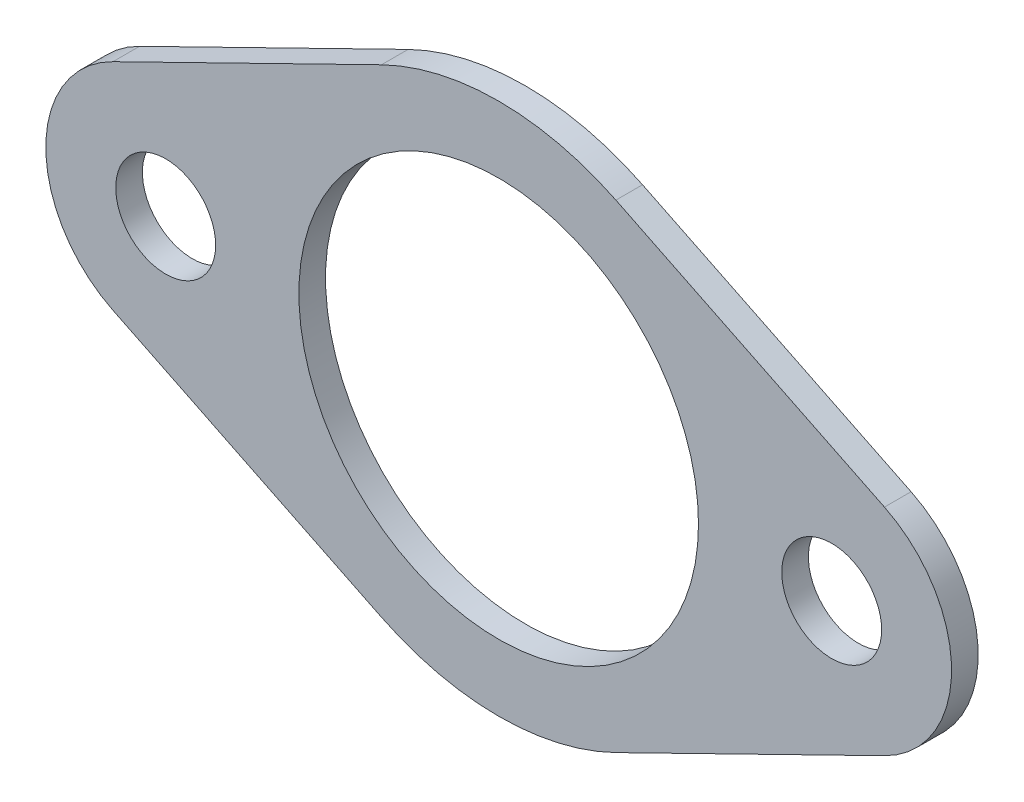
ISO-10303-21;
HEADER;
FILE_DESCRIPTION(('STEP AP214'),'2;1');
FILE_NAME('part.step','',(''),(''),'','','');
FILE_SCHEMA(('AUTOMOTIVE_DESIGN { 1 0 10303 214 1 1 1 1 }'));
ENDSEC;
DATA;
#1=APPLICATION_CONTEXT('core data for automotive mechanical design processes');
#2=APPLICATION_PROTOCOL_DEFINITION('international standard','automotive_design',2000,#1);
#3=PRODUCT_CONTEXT('',#1,'mechanical');
#4=PRODUCT('Part','Part','',(#3));
#5=PRODUCT_RELATED_PRODUCT_CATEGORY('part','',(#4));
#6=PRODUCT_DEFINITION_FORMATION('','',#4);
#7=PRODUCT_DEFINITION_CONTEXT('part definition',#1,'design');
#8=PRODUCT_DEFINITION('design','',#6,#7);
#9=PRODUCT_DEFINITION_SHAPE('','',#8);
#10=(LENGTH_UNIT() NAMED_UNIT(*) SI_UNIT(.MILLI.,.METRE.));
#11=(NAMED_UNIT(*) PLANE_ANGLE_UNIT() SI_UNIT($,.RADIAN.));
#12=(NAMED_UNIT(*) SI_UNIT($,.STERADIAN.) SOLID_ANGLE_UNIT());
#13=UNCERTAINTY_MEASURE_WITH_UNIT(LENGTH_MEASURE(1.E-05),#10,'distance_accuracy_value','');
#14=(GEOMETRIC_REPRESENTATION_CONTEXT(3) GLOBAL_UNCERTAINTY_ASSIGNED_CONTEXT((#13)) GLOBAL_UNIT_ASSIGNED_CONTEXT((#10,
#11,#12)) REPRESENTATION_CONTEXT('',''));
#15=CARTESIAN_POINT('',(0.,0.,0.));
#16=DIRECTION('',(0.,0.,1.));
#17=DIRECTION('',(1.,0.,0.));
#18=AXIS2_PLACEMENT_3D('',#15,#16,#17);
#19=CARTESIAN_POINT('',(63.5,0.,5.08));
#20=DIRECTION('',(0.,0.,1.));
#21=DIRECTION('',(1.,0.,0.));
#22=AXIS2_PLACEMENT_3D('',#19,#20,#21);
#23=PLANE('',#22);
#24=CARTESIAN_POINT('',(0.,0.,5.08));
#25=DIRECTION('',(0.,0.,1.));
#26=DIRECTION('',(1.,0.,0.));
#27=AXIS2_PLACEMENT_3D('',#24,#25,#26);
#28=CIRCLE('',#27,38.1);
#29=CARTESIAN_POINT('',(38.1,0.,5.08));
#30=VERTEX_POINT('',#29);
#31=EDGE_CURVE('E304',#30,#30,#28,.T.);
#32=ORIENTED_EDGE('',*,*,#31,.F.);
#33=EDGE_LOOP('',(#32));
#34=FACE_BOUND('',#33,.T.);
#35=CARTESIAN_POINT('',(63.5,0.,5.08));
#36=DIRECTION('',(0.,0.,1.));
#37=DIRECTION('',(1.,0.,0.));
#38=AXIS2_PLACEMENT_3D('',#35,#36,#37);
#39=CIRCLE('',#38,22.86);
#40=CARTESIAN_POINT('',(73.5584,-20.5282290867966,5.08));
#41=VERTEX_POINT('',#40);
#42=CARTESIAN_POINT('',(73.5584,20.5282290867966,5.08));
#43=VERTEX_POINT('',#42);
#44=EDGE_CURVE('E232',#41,#43,#39,.T.);
#45=ORIENTED_EDGE('',*,*,#44,.T.);
#46=DIRECTION('',(-0.897997772825746,0.44,0.));
#47=VECTOR('',#46,1.);
#48=CARTESIAN_POINT('',(73.5584,20.5282290867966,5.08));
#49=LINE('',#48,#47);
#50=CARTESIAN_POINT('',(22.352,45.6182868595479,5.08));
#51=VERTEX_POINT('',#50);
#52=EDGE_CURVE('E177',#43,#51,#49,.T.);
#53=ORIENTED_EDGE('',*,*,#52,.T.);
#54=CARTESIAN_POINT('',(0.,0.,5.08));
#55=DIRECTION('',(0.,0.,1.));
#56=DIRECTION('',(1.,0.,0.));
#57=AXIS2_PLACEMENT_3D('',#54,#55,#56);
#58=CIRCLE('',#57,50.8);
#59=CARTESIAN_POINT('',(-22.352,45.6182868595479,5.08));
#60=VERTEX_POINT('',#59);
#61=EDGE_CURVE('E247',#51,#60,#58,.T.);
#62=ORIENTED_EDGE('',*,*,#61,.T.);
#63=DIRECTION('',(-0.897997772825746,-0.44,0.));
#64=VECTOR('',#63,1.);
#65=CARTESIAN_POINT('',(-22.352,45.6182868595479,5.08));
#66=LINE('',#65,#64);
#67=CARTESIAN_POINT('',(-73.5584,20.5282290867965,5.08));
#68=VERTEX_POINT('',#67);
#69=EDGE_CURVE('E210',#60,#68,#66,.T.);
#70=ORIENTED_EDGE('',*,*,#69,.T.);
#71=CARTESIAN_POINT('',(-63.5,0.,5.08));
#72=DIRECTION('',(0.,0.,1.));
#73=DIRECTION('',(1.,0.,0.));
#74=AXIS2_PLACEMENT_3D('',#71,#72,#73);
#75=CIRCLE('',#74,22.86);
#76=CARTESIAN_POINT('',(-73.5584,-20.5282290867966,5.08));
#77=VERTEX_POINT('',#76);
#78=EDGE_CURVE('E207',#68,#77,#75,.T.);
#79=ORIENTED_EDGE('',*,*,#78,.T.);
#80=DIRECTION('',(-0.897997772825746,0.44,0.));
#81=VECTOR('',#80,1.);
#82=CARTESIAN_POINT('',(-22.352,-45.6182868595479,5.08));
#83=LINE('',#82,#81);
#84=CARTESIAN_POINT('',(-22.352,-45.6182868595479,5.08));
#85=VERTEX_POINT('',#84);
#86=EDGE_CURVE('E196',#85,#77,#83,.T.);
#87=ORIENTED_EDGE('',*,*,#86,.F.);
#88=CARTESIAN_POINT('',(0.,0.,5.08));
#89=DIRECTION('',(0.,0.,1.));
#90=DIRECTION('',(1.,0.,0.));
#91=AXIS2_PLACEMENT_3D('',#88,#89,#90);
#92=CIRCLE('',#91,50.8);
#93=CARTESIAN_POINT('',(22.352,-45.6182868595479,5.08));
#94=VERTEX_POINT('',#93);
#95=EDGE_CURVE('E202',#85,#94,#92,.T.);
#96=ORIENTED_EDGE('',*,*,#95,.T.);
#97=DIRECTION('',(0.897997772825746,0.44,0.));
#98=VECTOR('',#97,1.);
#99=CARTESIAN_POINT('',(22.352,-45.6182868595479,5.08));
#100=LINE('',#99,#98);
#101=EDGE_CURVE('E135',#94,#41,#100,.T.);
#102=ORIENTED_EDGE('',*,*,#101,.T.);
#103=EDGE_LOOP('',(#45,#53,#62,#70,#79,#87,#96,#102));
#104=FACE_BOUND('',#103,.T.);
#105=CARTESIAN_POINT('',(-63.5,0.,5.08));
#106=DIRECTION('',(0.,0.,1.));
#107=DIRECTION('',(1.,0.,0.));
#108=AXIS2_PLACEMENT_3D('',#105,#106,#107);
#109=CIRCLE('',#108,9.525);
#110=CARTESIAN_POINT('',(-53.975,0.,5.08));
#111=VERTEX_POINT('',#110);
#112=EDGE_CURVE('E220',#111,#111,#109,.T.);
#113=ORIENTED_EDGE('',*,*,#112,.F.);
#114=EDGE_LOOP('',(#113));
#115=FACE_BOUND('',#114,.T.);
#116=CARTESIAN_POINT('',(63.5,0.,5.08));
#117=DIRECTION('',(0.,0.,1.));
#118=DIRECTION('',(1.,0.,0.));
#119=AXIS2_PLACEMENT_3D('',#116,#117,#118);
#120=CIRCLE('',#119,9.52500000000001);
#121=CARTESIAN_POINT('',(73.025,0.,5.08));
#122=VERTEX_POINT('',#121);
#123=EDGE_CURVE('E295',#122,#122,#120,.T.);
#124=ORIENTED_EDGE('',*,*,#123,.F.);
#125=EDGE_LOOP('',(#124));
#126=FACE_BOUND('',#125,.T.);
#127=ADVANCED_FACE('F118',(#34,#104,#115,#126),#23,.T.);
#128=CARTESIAN_POINT('',(63.5,0.,0.));
#129=DIRECTION('',(0.,0.,1.));
#130=DIRECTION('',(1.,0.,0.));
#131=AXIS2_PLACEMENT_3D('',#128,#129,#130);
#132=PLANE('',#131);
#133=CARTESIAN_POINT('',(63.5,0.,0.));
#134=DIRECTION('',(0.,0.,1.));
#135=DIRECTION('',(1.,0.,0.));
#136=AXIS2_PLACEMENT_3D('',#133,#134,#135);
#137=CIRCLE('',#136,22.86);
#138=CARTESIAN_POINT('',(73.5584,-20.5282290867966,0.));
#139=VERTEX_POINT('',#138);
#140=CARTESIAN_POINT('',(73.5584,20.5282290867966,0.));
#141=VERTEX_POINT('',#140);
#142=EDGE_CURVE('E216',#139,#141,#137,.T.);
#143=ORIENTED_EDGE('',*,*,#142,.F.);
#144=DIRECTION('',(0.897997772825746,0.44,0.));
#145=VECTOR('',#144,1.);
#146=CARTESIAN_POINT('',(22.352,-45.6182868595479,0.));
#147=LINE('',#146,#145);
#148=CARTESIAN_POINT('',(22.352,-45.6182868595479,0.));
#149=VERTEX_POINT('',#148);
#150=EDGE_CURVE('E169',#149,#139,#147,.T.);
#151=ORIENTED_EDGE('',*,*,#150,.F.);
#152=CARTESIAN_POINT('',(0.,0.,0.));
#153=DIRECTION('',(0.,0.,1.));
#154=DIRECTION('',(1.,0.,0.));
#155=AXIS2_PLACEMENT_3D('',#152,#153,#154);
#156=CIRCLE('',#155,50.8);
#157=CARTESIAN_POINT('',(-22.352,-45.6182868595479,0.));
#158=VERTEX_POINT('',#157);
#159=EDGE_CURVE('E163',#158,#149,#156,.T.);
#160=ORIENTED_EDGE('',*,*,#159,.F.);
#161=DIRECTION('',(-0.897997772825746,0.44,0.));
#162=VECTOR('',#161,1.);
#163=CARTESIAN_POINT('',(-22.352,-45.6182868595479,0.));
#164=LINE('',#163,#162);
#165=CARTESIAN_POINT('',(-73.5584,-20.5282290867966,0.));
#166=VERTEX_POINT('',#165);
#167=EDGE_CURVE('E198',#158,#166,#164,.T.);
#168=ORIENTED_EDGE('',*,*,#167,.T.);
#169=CARTESIAN_POINT('',(-63.5,0.,0.));
#170=DIRECTION('',(0.,0.,1.));
#171=DIRECTION('',(1.,0.,0.));
#172=AXIS2_PLACEMENT_3D('',#169,#170,#171);
#173=CIRCLE('',#172,22.86);
#174=CARTESIAN_POINT('',(-73.5584,20.5282290867965,0.));
#175=VERTEX_POINT('',#174);
#176=EDGE_CURVE('E226',#175,#166,#173,.T.);
#177=ORIENTED_EDGE('',*,*,#176,.F.);
#178=DIRECTION('',(-0.897997772825746,-0.44,0.));
#179=VECTOR('',#178,1.);
#180=CARTESIAN_POINT('',(-22.352,45.6182868595479,0.));
#181=LINE('',#180,#179);
#182=CARTESIAN_POINT('',(-22.352,45.6182868595479,0.));
#183=VERTEX_POINT('',#182);
#184=EDGE_CURVE('E224',#183,#175,#181,.T.);
#185=ORIENTED_EDGE('',*,*,#184,.F.);
#186=CARTESIAN_POINT('',(0.,0.,0.));
#187=DIRECTION('',(0.,0.,1.));
#188=DIRECTION('',(1.,0.,0.));
#189=AXIS2_PLACEMENT_3D('',#186,#187,#188);
#190=CIRCLE('',#189,50.8);
#191=CARTESIAN_POINT('',(22.352,45.6182868595479,0.));
#192=VERTEX_POINT('',#191);
#193=EDGE_CURVE('E222',#192,#183,#190,.T.);
#194=ORIENTED_EDGE('',*,*,#193,.F.);
#195=DIRECTION('',(-0.897997772825746,0.44,0.));
#196=VECTOR('',#195,1.);
#197=CARTESIAN_POINT('',(73.5584,20.5282290867966,0.));
#198=LINE('',#197,#196);
#199=EDGE_CURVE('E219',#141,#192,#198,.T.);
#200=ORIENTED_EDGE('',*,*,#199,.F.);
#201=EDGE_LOOP('',(#143,#151,#160,#168,#177,#185,#194,#200));
#202=FACE_BOUND('',#201,.T.);
#203=CARTESIAN_POINT('',(-63.5,0.,0.));
#204=DIRECTION('',(0.,0.,1.));
#205=DIRECTION('',(1.,0.,0.));
#206=AXIS2_PLACEMENT_3D('',#203,#204,#205);
#207=CIRCLE('',#206,9.525);
#208=CARTESIAN_POINT('',(-53.975,0.,0.));
#209=VERTEX_POINT('',#208);
#210=EDGE_CURVE('E307',#209,#209,#207,.T.);
#211=ORIENTED_EDGE('',*,*,#210,.T.);
#212=EDGE_LOOP('',(#211));
#213=FACE_BOUND('',#212,.T.);
#214=CARTESIAN_POINT('',(0.,0.,0.));
#215=DIRECTION('',(0.,0.,1.));
#216=DIRECTION('',(1.,0.,0.));
#217=AXIS2_PLACEMENT_3D('',#214,#215,#216);
#218=CIRCLE('',#217,38.1);
#219=CARTESIAN_POINT('',(38.1,0.,0.));
#220=VERTEX_POINT('',#219);
#221=EDGE_CURVE('E301',#220,#220,#218,.T.);
#222=ORIENTED_EDGE('',*,*,#221,.T.);
#223=EDGE_LOOP('',(#222));
#224=FACE_BOUND('',#223,.T.);
#225=CARTESIAN_POINT('',(63.5,0.,0.));
#226=DIRECTION('',(0.,0.,1.));
#227=DIRECTION('',(1.,0.,0.));
#228=AXIS2_PLACEMENT_3D('',#225,#226,#227);
#229=CIRCLE('',#228,9.52500000000001);
#230=CARTESIAN_POINT('',(73.025,0.,0.));
#231=VERTEX_POINT('',#230);
#232=EDGE_CURVE('E298',#231,#231,#229,.T.);
#233=ORIENTED_EDGE('',*,*,#232,.T.);
#234=EDGE_LOOP('',(#233));
#235=FACE_BOUND('',#234,.T.);
#236=ADVANCED_FACE('F251',(#202,#213,#224,#235),#132,.F.);
#237=CARTESIAN_POINT('',(63.5,0.,5.08));
#238=DIRECTION('',(0.,0.,-1.));
#239=DIRECTION('',(-1.,0.,0.));
#240=AXIS2_PLACEMENT_3D('',#237,#238,#239);
#241=CYLINDRICAL_SURFACE('',#240,22.86);
#242=ORIENTED_EDGE('',*,*,#142,.T.);
#243=DIRECTION('',(0.,0.,-1.));
#244=VECTOR('',#243,1.);
#245=CARTESIAN_POINT('',(73.5584,20.5282290867966,5.08));
#246=LINE('',#245,#244);
#247=EDGE_CURVE('E12',#43,#141,#246,.T.);
#248=ORIENTED_EDGE('',*,*,#247,.F.);
#249=ORIENTED_EDGE('',*,*,#44,.F.);
#250=DIRECTION('',(0.,0.,-1.));
#251=VECTOR('',#250,1.);
#252=CARTESIAN_POINT('',(73.5584,-20.5282290867966,5.08));
#253=LINE('',#252,#251);
#254=EDGE_CURVE('E215',#41,#139,#253,.T.);
#255=ORIENTED_EDGE('',*,*,#254,.T.);
#256=EDGE_LOOP('',(#242,#248,#249,#255));
#257=FACE_BOUND('',#256,.T.);
#258=ADVANCED_FACE('F120',(#257),#241,.T.);
#259=CARTESIAN_POINT('',(73.5584,20.5282290867966,5.08));
#260=DIRECTION('',(-0.44,-0.897997772825746,0.));
#261=DIRECTION('',(0.897997772825746,-0.44,0.));
#262=AXIS2_PLACEMENT_3D('',#259,#260,#261);
#263=PLANE('',#262);
#264=ORIENTED_EDGE('',*,*,#199,.T.);
#265=DIRECTION('',(0.,0.,-1.));
#266=VECTOR('',#265,1.);
#267=CARTESIAN_POINT('',(22.352,45.6182868595479,5.08));
#268=LINE('',#267,#266);
#269=EDGE_CURVE('E127',#51,#192,#268,.T.);
#270=ORIENTED_EDGE('',*,*,#269,.F.);
#271=ORIENTED_EDGE('',*,*,#52,.F.);
#272=ORIENTED_EDGE('',*,*,#247,.T.);
#273=EDGE_LOOP('',(#264,#270,#271,#272));
#274=FACE_BOUND('',#273,.T.);
#275=ADVANCED_FACE('F374',(#274),#263,.F.);
#276=CARTESIAN_POINT('',(0.,0.,5.08));
#277=DIRECTION('',(0.,0.,-1.));
#278=DIRECTION('',(-1.,0.,0.));
#279=AXIS2_PLACEMENT_3D('',#276,#277,#278);
#280=CYLINDRICAL_SURFACE('',#279,50.8);
#281=ORIENTED_EDGE('',*,*,#193,.T.);
#282=DIRECTION('',(0.,0.,-1.));
#283=VECTOR('',#282,1.);
#284=CARTESIAN_POINT('',(-22.352,45.6182868595479,5.08));
#285=LINE('',#284,#283);
#286=EDGE_CURVE('E239',#60,#183,#285,.T.);
#287=ORIENTED_EDGE('',*,*,#286,.F.);
#288=ORIENTED_EDGE('',*,*,#61,.F.);
#289=ORIENTED_EDGE('',*,*,#269,.T.);
#290=EDGE_LOOP('',(#281,#287,#288,#289));
#291=FACE_BOUND('',#290,.T.);
#292=ADVANCED_FACE('F245',(#291),#280,.T.);
#293=CARTESIAN_POINT('',(-22.352,45.6182868595479,5.08));
#294=DIRECTION('',(0.44,-0.897997772825746,0.));
#295=DIRECTION('',(0.897997772825746,0.44,0.));
#296=AXIS2_PLACEMENT_3D('',#293,#294,#295);
#297=PLANE('',#296);
#298=ORIENTED_EDGE('',*,*,#184,.T.);
#299=DIRECTION('',(0.,0.,-1.));
#300=VECTOR('',#299,1.);
#301=CARTESIAN_POINT('',(-73.5584,20.5282290867965,5.08));
#302=LINE('',#301,#300);
#303=EDGE_CURVE('E236',#68,#175,#302,.T.);
#304=ORIENTED_EDGE('',*,*,#303,.F.);
#305=ORIENTED_EDGE('',*,*,#69,.F.);
#306=ORIENTED_EDGE('',*,*,#286,.T.);
#307=EDGE_LOOP('',(#298,#304,#305,#306));
#308=FACE_BOUND('',#307,.T.);
#309=ADVANCED_FACE('F256',(#308),#297,.F.);
#310=CARTESIAN_POINT('',(-63.5,0.,5.08));
#311=DIRECTION('',(0.,0.,-1.));
#312=DIRECTION('',(-1.,0.,0.));
#313=AXIS2_PLACEMENT_3D('',#310,#311,#312);
#314=CYLINDRICAL_SURFACE('',#313,22.86);
#315=ORIENTED_EDGE('',*,*,#176,.T.);
#316=DIRECTION('',(0.,0.,-1.));
#317=VECTOR('',#316,1.);
#318=CARTESIAN_POINT('',(-73.5584,-20.5282290867966,5.08));
#319=LINE('',#318,#317);
#320=EDGE_CURVE('E199',#77,#166,#319,.T.);
#321=ORIENTED_EDGE('',*,*,#320,.F.);
#322=ORIENTED_EDGE('',*,*,#78,.F.);
#323=ORIENTED_EDGE('',*,*,#303,.T.);
#324=EDGE_LOOP('',(#315,#321,#322,#323));
#325=FACE_BOUND('',#324,.T.);
#326=ADVANCED_FACE('F259',(#325),#314,.T.);
#327=CARTESIAN_POINT('',(-22.352,-45.6182868595479,5.08));
#328=DIRECTION('',(-0.44,-0.897997772825746,0.));
#329=DIRECTION('',(0.897997772825746,-0.44,0.));
#330=AXIS2_PLACEMENT_3D('',#327,#328,#329);
#331=PLANE('',#330);
#332=ORIENTED_EDGE('',*,*,#167,.F.);
#333=DIRECTION('',(0.,0.,-1.));
#334=VECTOR('',#333,1.);
#335=CARTESIAN_POINT('',(-22.352,-45.6182868595479,5.08));
#336=LINE('',#335,#334);
#337=EDGE_CURVE('E192',#85,#158,#336,.T.);
#338=ORIENTED_EDGE('',*,*,#337,.F.);
#339=ORIENTED_EDGE('',*,*,#86,.T.);
#340=ORIENTED_EDGE('',*,*,#320,.T.);
#341=EDGE_LOOP('',(#332,#338,#339,#340));
#342=FACE_BOUND('',#341,.T.);
#343=ADVANCED_FACE('F194',(#342),#331,.T.);
#344=CARTESIAN_POINT('',(0.,0.,5.08));
#345=DIRECTION('',(0.,0.,-1.));
#346=DIRECTION('',(-1.,0.,0.));
#347=AXIS2_PLACEMENT_3D('',#344,#345,#346);
#348=CYLINDRICAL_SURFACE('',#347,50.8);
#349=ORIENTED_EDGE('',*,*,#159,.T.);
#350=DIRECTION('',(0.,0.,-1.));
#351=VECTOR('',#350,1.);
#352=CARTESIAN_POINT('',(22.352,-45.6182868595479,5.08));
#353=LINE('',#352,#351);
#354=EDGE_CURVE('E200',#94,#149,#353,.T.);
#355=ORIENTED_EDGE('',*,*,#354,.F.);
#356=ORIENTED_EDGE('',*,*,#95,.F.);
#357=ORIENTED_EDGE('',*,*,#337,.T.);
#358=EDGE_LOOP('',(#349,#355,#356,#357));
#359=FACE_BOUND('',#358,.T.);
#360=ADVANCED_FACE('F203',(#359),#348,.T.);
#361=CARTESIAN_POINT('',(22.352,-45.6182868595479,5.08));
#362=DIRECTION('',(-0.44,0.897997772825746,0.));
#363=DIRECTION('',(-0.897997772825746,-0.44,0.));
#364=AXIS2_PLACEMENT_3D('',#361,#362,#363);
#365=PLANE('',#364);
#366=ORIENTED_EDGE('',*,*,#150,.T.);
#367=ORIENTED_EDGE('',*,*,#254,.F.);
#368=ORIENTED_EDGE('',*,*,#101,.F.);
#369=ORIENTED_EDGE('',*,*,#354,.T.);
#370=EDGE_LOOP('',(#366,#367,#368,#369));
#371=FACE_BOUND('',#370,.T.);
#372=ADVANCED_FACE('F263',(#371),#365,.F.);
#373=CARTESIAN_POINT('',(-63.5,0.,5.08));
#374=DIRECTION('',(0.,0.,-1.));
#375=DIRECTION('',(-1.,0.,0.));
#376=AXIS2_PLACEMENT_3D('',#373,#374,#375);
#377=CYLINDRICAL_SURFACE('',#376,9.525);
#378=ORIENTED_EDGE('',*,*,#112,.T.);
#379=EDGE_LOOP('',(#378));
#380=FACE_BOUND('',#379,.T.);
#381=ORIENTED_EDGE('',*,*,#210,.F.);
#382=EDGE_LOOP('',(#381));
#383=FACE_BOUND('',#382,.T.);
#384=ADVANCED_FACE('F265',(#380,#383),#377,.F.);
#385=CARTESIAN_POINT('',(0.,0.,5.08));
#386=DIRECTION('',(0.,0.,-1.));
#387=DIRECTION('',(-1.,0.,0.));
#388=AXIS2_PLACEMENT_3D('',#385,#386,#387);
#389=CYLINDRICAL_SURFACE('',#388,38.1);
#390=ORIENTED_EDGE('',*,*,#31,.T.);
#391=EDGE_LOOP('',(#390));
#392=FACE_BOUND('',#391,.T.);
#393=ORIENTED_EDGE('',*,*,#221,.F.);
#394=EDGE_LOOP('',(#393));
#395=FACE_BOUND('',#394,.T.);
#396=ADVANCED_FACE('F271',(#392,#395),#389,.F.);
#397=CARTESIAN_POINT('',(63.5,0.,5.08));
#398=DIRECTION('',(0.,0.,-1.));
#399=DIRECTION('',(-1.,0.,0.));
#400=AXIS2_PLACEMENT_3D('',#397,#398,#399);
#401=CYLINDRICAL_SURFACE('',#400,9.52500000000001);
#402=ORIENTED_EDGE('',*,*,#123,.T.);
#403=EDGE_LOOP('',(#402));
#404=FACE_BOUND('',#403,.T.);
#405=ORIENTED_EDGE('',*,*,#232,.F.);
#406=EDGE_LOOP('',(#405));
#407=FACE_BOUND('',#406,.T.);
#408=ADVANCED_FACE('F286',(#404,#407),#401,.F.);
#409=CLOSED_SHELL('',(#127,#236,#258,#275,#292,#309,#326,#343,#360,#372,#384,#396,#408));
#410=MANIFOLD_SOLID_BREP('B2',#409);
#411=ADVANCED_BREP_SHAPE_REPRESENTATION('',(#18,#410),#14);
#412=SHAPE_DEFINITION_REPRESENTATION(#9,#411);
ENDSEC;
END-ISO-10303-21;
